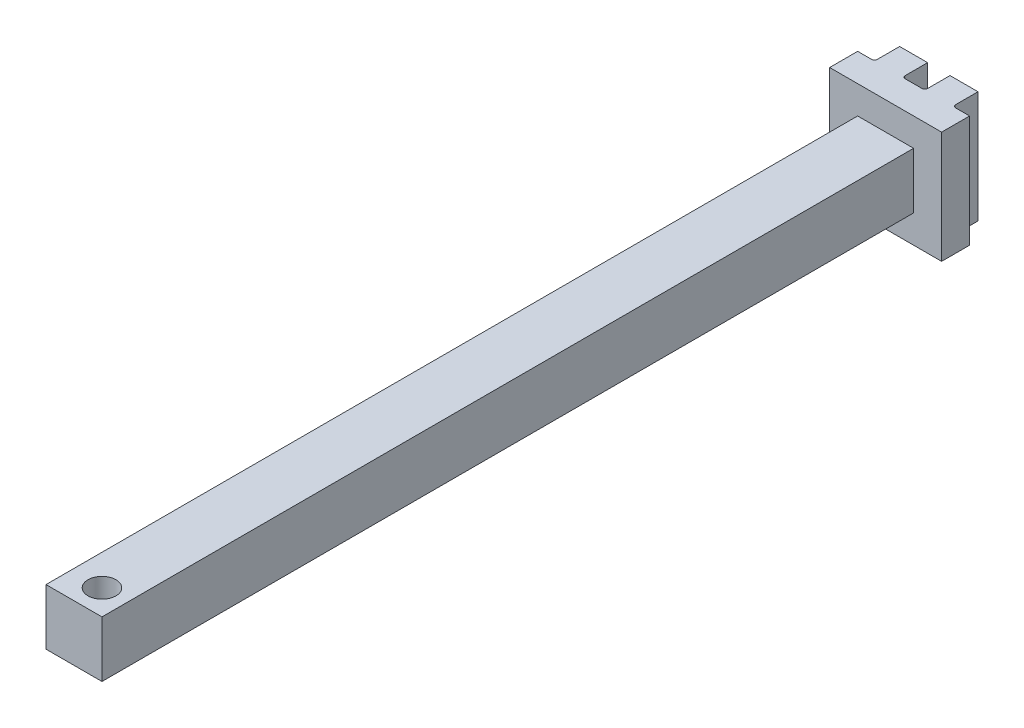
ISO-10303-21;
HEADER;
FILE_DESCRIPTION(('STEP AP214'),'2;1');
FILE_NAME('part.step','',(''),(''),'','','');
FILE_SCHEMA(('AUTOMOTIVE_DESIGN { 1 0 10303 214 1 1 1 1 }'));
ENDSEC;
DATA;
#1=APPLICATION_CONTEXT('core data for automotive mechanical design processes');
#2=APPLICATION_PROTOCOL_DEFINITION('international standard','automotive_design',2000,#1);
#3=PRODUCT_CONTEXT('',#1,'mechanical');
#4=PRODUCT('Part','Part','',(#3));
#5=PRODUCT_RELATED_PRODUCT_CATEGORY('part','',(#4));
#6=PRODUCT_DEFINITION_FORMATION('','',#4);
#7=PRODUCT_DEFINITION_CONTEXT('part definition',#1,'design');
#8=PRODUCT_DEFINITION('design','',#6,#7);
#9=PRODUCT_DEFINITION_SHAPE('','',#8);
#10=(LENGTH_UNIT() NAMED_UNIT(*) SI_UNIT(.MILLI.,.METRE.));
#11=(NAMED_UNIT(*) PLANE_ANGLE_UNIT() SI_UNIT($,.RADIAN.));
#12=(NAMED_UNIT(*) SI_UNIT($,.STERADIAN.) SOLID_ANGLE_UNIT());
#13=UNCERTAINTY_MEASURE_WITH_UNIT(LENGTH_MEASURE(1.E-05),#10,'distance_accuracy_value','');
#14=(GEOMETRIC_REPRESENTATION_CONTEXT(3) GLOBAL_UNCERTAINTY_ASSIGNED_CONTEXT((#13)) GLOBAL_UNIT_ASSIGNED_CONTEXT((#10,
#11,#12)) REPRESENTATION_CONTEXT('',''));
#15=CARTESIAN_POINT('',(0.,0.,0.));
#16=DIRECTION('',(0.,0.,1.));
#17=DIRECTION('',(1.,0.,0.));
#18=AXIS2_PLACEMENT_3D('',#15,#16,#17);
#19=CARTESIAN_POINT('',(0.,100.,0.));
#20=DIRECTION('',(0.,0.,-1.));
#21=DIRECTION('',(-1.,0.,0.));
#22=AXIS2_PLACEMENT_3D('',#19,#20,#21);
#23=PLANE('',#22);
#24=DIRECTION('',(-1.,0.,0.));
#25=VECTOR('',#24,1.);
#26=CARTESIAN_POINT('',(-50.,-50.,0.));
#27=LINE('',#26,#25);
#28=CARTESIAN_POINT('',(150.,-50.,0.));
#29=VERTEX_POINT('',#28);
#30=CARTESIAN_POINT('',(125.,-50.,0.));
#31=VERTEX_POINT('',#30);
#32=EDGE_CURVE('E227',#29,#31,#27,.T.);
#33=ORIENTED_EDGE('',*,*,#32,.T.);
#34=DIRECTION('',(0.,-1.,0.));
#35=VECTOR('',#34,1.);
#36=CARTESIAN_POINT('',(125.,150.,0.));
#37=LINE('',#36,#35);
#38=CARTESIAN_POINT('',(125.,150.,0.));
#39=VERTEX_POINT('',#38);
#40=EDGE_CURVE('E58',#31,#39,#37,.F.);
#41=ORIENTED_EDGE('',*,*,#40,.T.);
#42=DIRECTION('',(1.,0.,0.));
#43=VECTOR('',#42,1.);
#44=CARTESIAN_POINT('',(-50.,150.,0.));
#45=LINE('',#44,#43);
#46=CARTESIAN_POINT('',(150.,150.,0.));
#47=VERTEX_POINT('',#46);
#48=EDGE_CURVE('E239',#39,#47,#45,.T.);
#49=ORIENTED_EDGE('',*,*,#48,.T.);
#50=DIRECTION('',(0.,-1.,0.));
#51=VECTOR('',#50,1.);
#52=CARTESIAN_POINT('',(150.,-50.,0.));
#53=LINE('',#52,#51);
#54=EDGE_CURVE('E242',#47,#29,#53,.T.);
#55=ORIENTED_EDGE('',*,*,#54,.T.);
#56=EDGE_LOOP('',(#33,#41,#49,#55));
#57=FACE_BOUND('',#56,.T.);
#58=ADVANCED_FACE('F37',(#57),#23,.T.);
#59=CARTESIAN_POINT('',(-50.,150.,0.));
#60=VERTEX_POINT('',#59);
#61=CARTESIAN_POINT('',(-25.,150.,0.));
#62=VERTEX_POINT('',#61);
#63=EDGE_CURVE('E251',#60,#62,#45,.T.);
#64=ORIENTED_EDGE('',*,*,#63,.T.);
#65=DIRECTION('',(0.,-1.,0.));
#66=VECTOR('',#65,1.);
#67=CARTESIAN_POINT('',(-25.,-50.,0.));
#68=LINE('',#67,#66);
#69=CARTESIAN_POINT('',(-25.,-50.,0.));
#70=VERTEX_POINT('',#69);
#71=EDGE_CURVE('E282',#62,#70,#68,.T.);
#72=ORIENTED_EDGE('',*,*,#71,.T.);
#73=CARTESIAN_POINT('',(-50.,-50.,0.));
#74=VERTEX_POINT('',#73);
#75=EDGE_CURVE('E269',#70,#74,#27,.T.);
#76=ORIENTED_EDGE('',*,*,#75,.T.);
#77=DIRECTION('',(0.,1.,0.));
#78=VECTOR('',#77,1.);
#79=CARTESIAN_POINT('',(-50.,-50.,0.));
#80=LINE('',#79,#78);
#81=EDGE_CURVE('E221',#74,#60,#80,.T.);
#82=ORIENTED_EDGE('',*,*,#81,.T.);
#83=EDGE_LOOP('',(#64,#72,#76,#82));
#84=FACE_BOUND('',#83,.T.);
#85=ADVANCED_FACE('F367',(#84),#23,.T.);
#86=CARTESIAN_POINT('',(0.,0.,1500.));
#87=DIRECTION('',(1.,0.,0.));
#88=DIRECTION('',(0.,0.,-1.));
#89=AXIS2_PLACEMENT_3D('',#86,#87,#88);
#90=PLANE('',#89);
#91=DIRECTION('',(0.,1.,0.));
#92=VECTOR('',#91,1.);
#93=CARTESIAN_POINT('',(0.,0.,50.));
#94=LINE('',#93,#92);
#95=CARTESIAN_POINT('',(0.,0.,50.));
#96=VERTEX_POINT('',#95);
#97=CARTESIAN_POINT('',(0.,100.,50.));
#98=VERTEX_POINT('',#97);
#99=EDGE_CURVE('E348',#96,#98,#94,.T.);
#100=ORIENTED_EDGE('',*,*,#99,.F.);
#101=DIRECTION('',(0.,0.,-1.));
#102=VECTOR('',#101,1.);
#103=CARTESIAN_POINT('',(0.,0.,1500.));
#104=LINE('',#103,#102);
#105=CARTESIAN_POINT('',(0.,0.,1500.));
#106=VERTEX_POINT('',#105);
#107=EDGE_CURVE('E316',#106,#96,#104,.T.);
#108=ORIENTED_EDGE('',*,*,#107,.F.);
#109=DIRECTION('',(0.,-1.,0.));
#110=VECTOR('',#109,1.);
#111=CARTESIAN_POINT('',(0.,0.,1500.));
#112=LINE('',#111,#110);
#113=CARTESIAN_POINT('',(0.,100.,1500.));
#114=VERTEX_POINT('',#113);
#115=EDGE_CURVE('E339',#114,#106,#112,.T.);
#116=ORIENTED_EDGE('',*,*,#115,.F.);
#117=DIRECTION('',(0.,0.,-1.));
#118=VECTOR('',#117,1.);
#119=CARTESIAN_POINT('',(0.,100.,1500.));
#120=LINE('',#119,#118);
#121=EDGE_CURVE('E330',#114,#98,#120,.T.);
#122=ORIENTED_EDGE('',*,*,#121,.T.);
#123=EDGE_LOOP('',(#100,#108,#116,#122));
#124=FACE_BOUND('',#123,.T.);
#125=ADVANCED_FACE('F416',(#124),#90,.F.);
#126=CARTESIAN_POINT('',(0.,0.,1500.));
#127=DIRECTION('',(0.,1.,0.));
#128=DIRECTION('',(0.,0.,1.));
#129=AXIS2_PLACEMENT_3D('',#126,#127,#128);
#130=PLANE('',#129);
#131=CARTESIAN_POINT('',(55.,0.,1455.));
#132=DIRECTION('',(0.,-1.,0.));
#133=DIRECTION('',(0.,0.,-1.));
#134=AXIS2_PLACEMENT_3D('',#131,#132,#133);
#135=CIRCLE('',#134,25.);
#136=CARTESIAN_POINT('',(55.,0.,1430.));
#137=VERTEX_POINT('',#136);
#138=EDGE_CURVE('E345',#137,#137,#135,.T.);
#139=ORIENTED_EDGE('',*,*,#138,.F.);
#140=EDGE_LOOP('',(#139));
#141=FACE_BOUND('',#140,.T.);
#142=DIRECTION('',(-1.,0.,0.));
#143=VECTOR('',#142,1.);
#144=CARTESIAN_POINT('',(0.,0.,50.));
#145=LINE('',#144,#143);
#146=CARTESIAN_POINT('',(100.,0.,50.));
#147=VERTEX_POINT('',#146);
#148=EDGE_CURVE('E350',#147,#96,#145,.T.);
#149=ORIENTED_EDGE('',*,*,#148,.F.);
#150=DIRECTION('',(0.,0.,-1.));
#151=VECTOR('',#150,1.);
#152=CARTESIAN_POINT('',(100.,0.,1500.));
#153=LINE('',#152,#151);
#154=CARTESIAN_POINT('',(100.,0.,1500.));
#155=VERTEX_POINT('',#154);
#156=EDGE_CURVE('E321',#155,#147,#153,.T.);
#157=ORIENTED_EDGE('',*,*,#156,.F.);
#158=DIRECTION('',(1.,0.,0.));
#159=VECTOR('',#158,1.);
#160=CARTESIAN_POINT('',(0.,0.,1500.));
#161=LINE('',#160,#159);
#162=EDGE_CURVE('E337',#106,#155,#161,.T.);
#163=ORIENTED_EDGE('',*,*,#162,.F.);
#164=ORIENTED_EDGE('',*,*,#107,.T.);
#165=EDGE_LOOP('',(#149,#157,#163,#164));
#166=FACE_BOUND('',#165,.T.);
#167=ADVANCED_FACE('F454',(#141,#166),#130,.F.);
#168=CARTESIAN_POINT('',(100.,0.,1500.));
#169=DIRECTION('',(-1.,0.,0.));
#170=DIRECTION('',(0.,0.,1.));
#171=AXIS2_PLACEMENT_3D('',#168,#169,#170);
#172=PLANE('',#171);
#173=DIRECTION('',(0.,-1.,0.));
#174=VECTOR('',#173,1.);
#175=CARTESIAN_POINT('',(100.,0.,50.));
#176=LINE('',#175,#174);
#177=CARTESIAN_POINT('',(100.,100.,50.));
#178=VERTEX_POINT('',#177);
#179=EDGE_CURVE('E352',#178,#147,#176,.T.);
#180=ORIENTED_EDGE('',*,*,#179,.F.);
#181=DIRECTION('',(0.,0.,-1.));
#182=VECTOR('',#181,1.);
#183=CARTESIAN_POINT('',(100.,100.,1500.));
#184=LINE('',#183,#182);
#185=CARTESIAN_POINT('',(100.,100.,1500.));
#186=VERTEX_POINT('',#185);
#187=EDGE_CURVE('E326',#186,#178,#184,.T.);
#188=ORIENTED_EDGE('',*,*,#187,.F.);
#189=DIRECTION('',(0.,1.,0.));
#190=VECTOR('',#189,1.);
#191=CARTESIAN_POINT('',(100.,0.,1500.));
#192=LINE('',#191,#190);
#193=EDGE_CURVE('E335',#155,#186,#192,.T.);
#194=ORIENTED_EDGE('',*,*,#193,.F.);
#195=ORIENTED_EDGE('',*,*,#156,.T.);
#196=EDGE_LOOP('',(#180,#188,#194,#195));
#197=FACE_BOUND('',#196,.T.);
#198=ADVANCED_FACE('F446',(#197),#172,.F.);
#199=CARTESIAN_POINT('',(0.,100.,1500.));
#200=DIRECTION('',(0.,-1.,0.));
#201=DIRECTION('',(0.,0.,-1.));
#202=AXIS2_PLACEMENT_3D('',#199,#200,#201);
#203=PLANE('',#202);
#204=CARTESIAN_POINT('',(55.,100.,1455.));
#205=DIRECTION('',(0.,-1.,0.));
#206=DIRECTION('',(0.,0.,-1.));
#207=AXIS2_PLACEMENT_3D('',#204,#205,#206);
#208=CIRCLE('',#207,25.);
#209=CARTESIAN_POINT('',(55.,100.,1430.));
#210=VERTEX_POINT('',#209);
#211=EDGE_CURVE('E342',#210,#210,#208,.F.);
#212=ORIENTED_EDGE('',*,*,#211,.F.);
#213=EDGE_LOOP('',(#212));
#214=FACE_BOUND('',#213,.T.);
#215=DIRECTION('',(1.,0.,0.));
#216=VECTOR('',#215,1.);
#217=CARTESIAN_POINT('',(0.,100.,50.));
#218=LINE('',#217,#216);
#219=EDGE_CURVE('E256',#98,#178,#218,.T.);
#220=ORIENTED_EDGE('',*,*,#219,.F.);
#221=ORIENTED_EDGE('',*,*,#121,.F.);
#222=DIRECTION('',(-1.,0.,0.));
#223=VECTOR('',#222,1.);
#224=CARTESIAN_POINT('',(0.,100.,1500.));
#225=LINE('',#224,#223);
#226=EDGE_CURVE('E333',#186,#114,#225,.T.);
#227=ORIENTED_EDGE('',*,*,#226,.F.);
#228=ORIENTED_EDGE('',*,*,#187,.T.);
#229=EDGE_LOOP('',(#220,#221,#227,#228));
#230=FACE_BOUND('',#229,.T.);
#231=ADVANCED_FACE('F441',(#214,#230),#203,.F.);
#232=CARTESIAN_POINT('',(0.,100.,1500.));
#233=DIRECTION('',(0.,0.,-1.));
#234=DIRECTION('',(-1.,0.,0.));
#235=AXIS2_PLACEMENT_3D('',#232,#233,#234);
#236=PLANE('',#235);
#237=ORIENTED_EDGE('',*,*,#115,.T.);
#238=ORIENTED_EDGE('',*,*,#162,.T.);
#239=ORIENTED_EDGE('',*,*,#193,.T.);
#240=ORIENTED_EDGE('',*,*,#226,.T.);
#241=EDGE_LOOP('',(#237,#238,#239,#240));
#242=FACE_BOUND('',#241,.T.);
#243=ADVANCED_FACE('F438',(#242),#236,.F.);
#244=CARTESIAN_POINT('',(55.,100.001,1455.));
#245=DIRECTION('',(0.,-1.,0.));
#246=DIRECTION('',(0.,0.,-1.));
#247=AXIS2_PLACEMENT_3D('',#244,#245,#246);
#248=CYLINDRICAL_SURFACE('',#247,25.);
#249=ORIENTED_EDGE('',*,*,#138,.T.);
#250=EDGE_LOOP('',(#249));
#251=FACE_BOUND('',#250,.T.);
#252=ORIENTED_EDGE('',*,*,#211,.T.);
#253=EDGE_LOOP('',(#252));
#254=FACE_BOUND('',#253,.T.);
#255=ADVANCED_FACE('F436',(#251,#254),#248,.F.);
#256=CARTESIAN_POINT('',(-50.,150.,50.));
#257=DIRECTION('',(0.,0.,-1.));
#258=DIRECTION('',(-1.,0.,0.));
#259=AXIS2_PLACEMENT_3D('',#256,#257,#258);
#260=PLANE('',#259);
#261=DIRECTION('',(0.,1.,0.));
#262=VECTOR('',#261,1.);
#263=CARTESIAN_POINT('',(-50.,-50.,50.));
#264=LINE('',#263,#262);
#265=CARTESIAN_POINT('',(-50.,-50.,50.));
#266=VERTEX_POINT('',#265);
#267=CARTESIAN_POINT('',(-50.,150.,50.));
#268=VERTEX_POINT('',#267);
#269=EDGE_CURVE('E223',#266,#268,#264,.T.);
#270=ORIENTED_EDGE('',*,*,#269,.F.);
#271=DIRECTION('',(-1.,0.,0.));
#272=VECTOR('',#271,1.);
#273=CARTESIAN_POINT('',(-50.,-50.,50.));
#274=LINE('',#273,#272);
#275=CARTESIAN_POINT('',(150.,-50.,50.));
#276=VERTEX_POINT('',#275);
#277=EDGE_CURVE('E233',#276,#266,#274,.T.);
#278=ORIENTED_EDGE('',*,*,#277,.F.);
#279=DIRECTION('',(0.,-1.,0.));
#280=VECTOR('',#279,1.);
#281=CARTESIAN_POINT('',(150.,-50.,50.));
#282=LINE('',#281,#280);
#283=CARTESIAN_POINT('',(150.,150.,50.));
#284=VERTEX_POINT('',#283);
#285=EDGE_CURVE('E230',#284,#276,#282,.T.);
#286=ORIENTED_EDGE('',*,*,#285,.F.);
#287=DIRECTION('',(1.,0.,0.));
#288=VECTOR('',#287,1.);
#289=CARTESIAN_POINT('',(-50.,150.,50.));
#290=LINE('',#289,#288);
#291=EDGE_CURVE('E226',#268,#284,#290,.T.);
#292=ORIENTED_EDGE('',*,*,#291,.F.);
#293=EDGE_LOOP('',(#270,#278,#286,#292));
#294=FACE_BOUND('',#293,.T.);
#295=ORIENTED_EDGE('',*,*,#148,.T.);
#296=ORIENTED_EDGE('',*,*,#99,.T.);
#297=ORIENTED_EDGE('',*,*,#219,.T.);
#298=ORIENTED_EDGE('',*,*,#179,.T.);
#299=EDGE_LOOP('',(#295,#296,#297,#298));
#300=FACE_BOUND('',#299,.T.);
#301=ADVANCED_FACE('F372',(#294,#300),#260,.F.);
#302=CARTESIAN_POINT('',(-50.,-50.,50.));
#303=DIRECTION('',(-1.,0.,0.));
#304=DIRECTION('',(0.,0.,1.));
#305=AXIS2_PLACEMENT_3D('',#302,#303,#304);
#306=PLANE('',#305);
#307=ORIENTED_EDGE('',*,*,#81,.F.);
#308=DIRECTION('',(0.,0.,-1.));
#309=VECTOR('',#308,1.);
#310=CARTESIAN_POINT('',(-50.,-50.,50.));
#311=LINE('',#310,#309);
#312=EDGE_CURVE('E264',#266,#74,#311,.T.);
#313=ORIENTED_EDGE('',*,*,#312,.F.);
#314=ORIENTED_EDGE('',*,*,#269,.T.);
#315=DIRECTION('',(0.,0.,-1.));
#316=VECTOR('',#315,1.);
#317=CARTESIAN_POINT('',(-50.,150.,50.));
#318=LINE('',#317,#316);
#319=EDGE_CURVE('E236',#268,#60,#318,.T.);
#320=ORIENTED_EDGE('',*,*,#319,.T.);
#321=EDGE_LOOP('',(#307,#313,#314,#320));
#322=FACE_BOUND('',#321,.T.);
#323=ADVANCED_FACE('F366',(#322),#306,.T.);
#324=CARTESIAN_POINT('',(-50.,-50.,50.));
#325=DIRECTION('',(0.,-1.,0.));
#326=DIRECTION('',(1.,0.,0.));
#327=AXIS2_PLACEMENT_3D('',#324,#325,#326);
#328=PLANE('',#327);
#329=ORIENTED_EDGE('',*,*,#32,.F.);
#330=DIRECTION('',(0.,0.,-1.));
#331=VECTOR('',#330,1.);
#332=CARTESIAN_POINT('',(150.,-50.,50.));
#333=LINE('',#332,#331);
#334=EDGE_CURVE('E357',#276,#29,#333,.T.);
#335=ORIENTED_EDGE('',*,*,#334,.F.);
#336=ORIENTED_EDGE('',*,*,#277,.T.);
#337=ORIENTED_EDGE('',*,*,#312,.T.);
#338=ORIENTED_EDGE('',*,*,#75,.F.);
#339=CARTESIAN_POINT('',(-25.,-50.,-5.));
#340=DIRECTION('',(0.,-1.,0.));
#341=DIRECTION('',(1.,0.,0.));
#342=AXIS2_PLACEMENT_3D('',#339,#340,#341);
#343=CIRCLE('',#342,5.);
#344=CARTESIAN_POINT('',(-20.,-50.,-5.));
#345=VERTEX_POINT('',#344);
#346=EDGE_CURVE('E380',#70,#345,#343,.F.);
#347=ORIENTED_EDGE('',*,*,#346,.T.);
#348=DIRECTION('',(0.,0.,-1.));
#349=VECTOR('',#348,1.);
#350=CARTESIAN_POINT('',(-20.,-50.,0.));
#351=LINE('',#350,#349);
#352=CARTESIAN_POINT('',(-20.,-50.,-45.));
#353=VERTEX_POINT('',#352);
#354=EDGE_CURVE('E207',#345,#353,#351,.T.);
#355=ORIENTED_EDGE('',*,*,#354,.T.);
#356=DIRECTION('',(1.,0.,0.));
#357=VECTOR('',#356,1.);
#358=CARTESIAN_POINT('',(-20.,-50.,-45.));
#359=LINE('',#358,#357);
#360=CARTESIAN_POINT('',(30.,-50.,-45.));
#361=VERTEX_POINT('',#360);
#362=EDGE_CURVE('E208',#353,#361,#359,.T.);
#363=ORIENTED_EDGE('',*,*,#362,.T.);
#364=DIRECTION('',(0.,0.,1.));
#365=VECTOR('',#364,1.);
#366=CARTESIAN_POINT('',(30.,-50.,0.));
#367=LINE('',#366,#365);
#368=CARTESIAN_POINT('',(30.,-50.,-5.));
#369=VERTEX_POINT('',#368);
#370=EDGE_CURVE('E211',#361,#369,#367,.T.);
#371=ORIENTED_EDGE('',*,*,#370,.T.);
#372=CARTESIAN_POINT('',(35.,-50.,-5.));
#373=DIRECTION('',(0.,-1.,0.));
#374=DIRECTION('',(1.,0.,0.));
#375=AXIS2_PLACEMENT_3D('',#372,#373,#374);
#376=CIRCLE('',#375,5.);
#377=CARTESIAN_POINT('',(35.,-50.,0.));
#378=VERTEX_POINT('',#377);
#379=EDGE_CURVE('E306',#369,#378,#376,.F.);
#380=ORIENTED_EDGE('',*,*,#379,.T.);
#381=CARTESIAN_POINT('',(65.,-50.,0.));
#382=VERTEX_POINT('',#381);
#383=EDGE_CURVE('E259',#382,#378,#27,.T.);
#384=ORIENTED_EDGE('',*,*,#383,.F.);
#385=CARTESIAN_POINT('',(65.,-50.,-5.));
#386=DIRECTION('',(0.,-1.,0.));
#387=DIRECTION('',(1.,0.,0.));
#388=AXIS2_PLACEMENT_3D('',#385,#386,#387);
#389=CIRCLE('',#388,5.);
#390=CARTESIAN_POINT('',(70.,-50.,-5.));
#391=VERTEX_POINT('',#390);
#392=EDGE_CURVE('E379',#382,#391,#389,.F.);
#393=ORIENTED_EDGE('',*,*,#392,.T.);
#394=DIRECTION('',(0.,0.,-1.));
#395=VECTOR('',#394,1.);
#396=CARTESIAN_POINT('',(70.,-50.,0.));
#397=LINE('',#396,#395);
#398=CARTESIAN_POINT('',(70.,-50.,-45.));
#399=VERTEX_POINT('',#398);
#400=EDGE_CURVE('E203',#391,#399,#397,.T.);
#401=ORIENTED_EDGE('',*,*,#400,.T.);
#402=DIRECTION('',(1.,0.,0.));
#403=VECTOR('',#402,1.);
#404=CARTESIAN_POINT('',(70.,-50.,-45.));
#405=LINE('',#404,#403);
#406=CARTESIAN_POINT('',(120.,-50.,-45.));
#407=VERTEX_POINT('',#406);
#408=EDGE_CURVE('E199',#399,#407,#405,.T.);
#409=ORIENTED_EDGE('',*,*,#408,.T.);
#410=DIRECTION('',(0.,0.,1.));
#411=VECTOR('',#410,1.);
#412=CARTESIAN_POINT('',(120.,-50.,0.));
#413=LINE('',#412,#411);
#414=CARTESIAN_POINT('',(120.,-50.,-5.));
#415=VERTEX_POINT('',#414);
#416=EDGE_CURVE('E190',#407,#415,#413,.T.);
#417=ORIENTED_EDGE('',*,*,#416,.T.);
#418=CARTESIAN_POINT('',(125.,-50.,-5.));
#419=DIRECTION('',(0.,-1.,0.));
#420=DIRECTION('',(1.,0.,0.));
#421=AXIS2_PLACEMENT_3D('',#418,#419,#420);
#422=CIRCLE('',#421,5.);
#423=EDGE_CURVE('E45',#415,#31,#422,.F.);
#424=ORIENTED_EDGE('',*,*,#423,.T.);
#425=EDGE_LOOP('',(#329,#335,#336,#337,#338,#347,#355,#363,#371,#380,#384,#393,#401,#409,#417,#424));
#426=FACE_BOUND('',#425,.T.);
#427=ADVANCED_FACE('F304',(#426),#328,.T.);
#428=CARTESIAN_POINT('',(150.,-50.,50.));
#429=DIRECTION('',(1.,0.,0.));
#430=DIRECTION('',(0.,0.,-1.));
#431=AXIS2_PLACEMENT_3D('',#428,#429,#430);
#432=PLANE('',#431);
#433=ORIENTED_EDGE('',*,*,#54,.F.);
#434=DIRECTION('',(0.,0.,-1.));
#435=VECTOR('',#434,1.);
#436=CARTESIAN_POINT('',(150.,150.,50.));
#437=LINE('',#436,#435);
#438=EDGE_CURVE('E355',#284,#47,#437,.T.);
#439=ORIENTED_EDGE('',*,*,#438,.F.);
#440=ORIENTED_EDGE('',*,*,#285,.T.);
#441=ORIENTED_EDGE('',*,*,#334,.T.);
#442=EDGE_LOOP('',(#433,#439,#440,#441));
#443=FACE_BOUND('',#442,.T.);
#444=ADVANCED_FACE('F369',(#443),#432,.T.);
#445=CARTESIAN_POINT('',(-50.,150.,50.));
#446=DIRECTION('',(0.,1.,0.));
#447=DIRECTION('',(-1.,0.,0.));
#448=AXIS2_PLACEMENT_3D('',#445,#446,#447);
#449=PLANE('',#448);
#450=ORIENTED_EDGE('',*,*,#63,.F.);
#451=ORIENTED_EDGE('',*,*,#319,.F.);
#452=ORIENTED_EDGE('',*,*,#291,.T.);
#453=ORIENTED_EDGE('',*,*,#438,.T.);
#454=ORIENTED_EDGE('',*,*,#48,.F.);
#455=CARTESIAN_POINT('',(125.,150.,-5.));
#456=DIRECTION('',(0.,1.,0.));
#457=DIRECTION('',(-1.,0.,0.));
#458=AXIS2_PLACEMENT_3D('',#455,#456,#457);
#459=CIRCLE('',#458,5.);
#460=CARTESIAN_POINT('',(120.,150.,-5.));
#461=VERTEX_POINT('',#460);
#462=EDGE_CURVE('E11',#39,#461,#459,.F.);
#463=ORIENTED_EDGE('',*,*,#462,.T.);
#464=DIRECTION('',(0.,0.,1.));
#465=VECTOR('',#464,1.);
#466=CARTESIAN_POINT('',(120.,150.,0.));
#467=LINE('',#466,#465);
#468=CARTESIAN_POINT('',(120.,150.,-45.));
#469=VERTEX_POINT('',#468);
#470=EDGE_CURVE('E173',#469,#461,#467,.T.);
#471=ORIENTED_EDGE('',*,*,#470,.F.);
#472=DIRECTION('',(1.,0.,0.));
#473=VECTOR('',#472,1.);
#474=CARTESIAN_POINT('',(70.,150.,-45.));
#475=LINE('',#474,#473);
#476=CARTESIAN_POINT('',(70.,150.,-45.));
#477=VERTEX_POINT('',#476);
#478=EDGE_CURVE('E179',#477,#469,#475,.T.);
#479=ORIENTED_EDGE('',*,*,#478,.F.);
#480=DIRECTION('',(0.,0.,-1.));
#481=VECTOR('',#480,1.);
#482=CARTESIAN_POINT('',(70.,150.,0.));
#483=LINE('',#482,#481);
#484=CARTESIAN_POINT('',(70.,150.,-5.));
#485=VERTEX_POINT('',#484);
#486=EDGE_CURVE('E185',#485,#477,#483,.T.);
#487=ORIENTED_EDGE('',*,*,#486,.F.);
#488=CARTESIAN_POINT('',(65.,150.,-5.));
#489=DIRECTION('',(0.,1.,0.));
#490=DIRECTION('',(-1.,0.,0.));
#491=AXIS2_PLACEMENT_3D('',#488,#489,#490);
#492=CIRCLE('',#491,5.);
#493=CARTESIAN_POINT('',(65.,150.,0.));
#494=VERTEX_POINT('',#493);
#495=EDGE_CURVE('E382',#485,#494,#492,.F.);
#496=ORIENTED_EDGE('',*,*,#495,.T.);
#497=CARTESIAN_POINT('',(35.,150.,0.));
#498=VERTEX_POINT('',#497);
#499=EDGE_CURVE('E255',#498,#494,#45,.T.);
#500=ORIENTED_EDGE('',*,*,#499,.F.);
#501=CARTESIAN_POINT('',(35.,150.,-5.));
#502=DIRECTION('',(0.,1.,0.));
#503=DIRECTION('',(-1.,0.,0.));
#504=AXIS2_PLACEMENT_3D('',#501,#502,#503);
#505=CIRCLE('',#504,5.);
#506=CARTESIAN_POINT('',(30.,150.,-5.));
#507=VERTEX_POINT('',#506);
#508=EDGE_CURVE('E384',#498,#507,#505,.F.);
#509=ORIENTED_EDGE('',*,*,#508,.T.);
#510=DIRECTION('',(0.,0.,1.));
#511=VECTOR('',#510,1.);
#512=CARTESIAN_POINT('',(30.,150.,0.));
#513=LINE('',#512,#511);
#514=CARTESIAN_POINT('',(30.,150.,-45.));
#515=VERTEX_POINT('',#514);
#516=EDGE_CURVE('E217',#515,#507,#513,.T.);
#517=ORIENTED_EDGE('',*,*,#516,.F.);
#518=DIRECTION('',(1.,0.,0.));
#519=VECTOR('',#518,1.);
#520=CARTESIAN_POINT('',(-20.,150.,-45.));
#521=LINE('',#520,#519);
#522=CARTESIAN_POINT('',(-20.,150.,-45.));
#523=VERTEX_POINT('',#522);
#524=EDGE_CURVE('E212',#523,#515,#521,.T.);
#525=ORIENTED_EDGE('',*,*,#524,.F.);
#526=DIRECTION('',(0.,0.,-1.));
#527=VECTOR('',#526,1.);
#528=CARTESIAN_POINT('',(-20.,150.,0.));
#529=LINE('',#528,#527);
#530=CARTESIAN_POINT('',(-20.,150.,-5.));
#531=VERTEX_POINT('',#530);
#532=EDGE_CURVE('E222',#531,#523,#529,.T.);
#533=ORIENTED_EDGE('',*,*,#532,.F.);
#534=CARTESIAN_POINT('',(-25.,150.,-5.));
#535=DIRECTION('',(0.,1.,0.));
#536=DIRECTION('',(-1.,0.,0.));
#537=AXIS2_PLACEMENT_3D('',#534,#535,#536);
#538=CIRCLE('',#537,5.);
#539=EDGE_CURVE('E375',#531,#62,#538,.F.);
#540=ORIENTED_EDGE('',*,*,#539,.T.);
#541=EDGE_LOOP('',(#450,#451,#452,#453,#454,#463,#471,#479,#487,#496,#500,#509,#517,#525,#533,#540));
#542=FACE_BOUND('',#541,.T.);
#543=ADVANCED_FACE('F176',(#542),#449,.T.);
#544=ORIENTED_EDGE('',*,*,#383,.T.);
#545=DIRECTION('',(0.,-1.,0.));
#546=VECTOR('',#545,1.);
#547=CARTESIAN_POINT('',(35.,150.,0.));
#548=LINE('',#547,#546);
#549=EDGE_CURVE('E281',#378,#498,#548,.F.);
#550=ORIENTED_EDGE('',*,*,#549,.T.);
#551=ORIENTED_EDGE('',*,*,#499,.T.);
#552=DIRECTION('',(0.,-1.,0.));
#553=VECTOR('',#552,1.);
#554=CARTESIAN_POINT('',(65.,-50.,0.));
#555=LINE('',#554,#553);
#556=EDGE_CURVE('E279',#494,#382,#555,.T.);
#557=ORIENTED_EDGE('',*,*,#556,.T.);
#558=EDGE_LOOP('',(#544,#550,#551,#557));
#559=FACE_BOUND('',#558,.T.);
#560=ADVANCED_FACE('F392',(#559),#23,.T.);
#561=CARTESIAN_POINT('',(-20.,217.268120235369,-45.));
#562=DIRECTION('',(0.,0.,-1.));
#563=DIRECTION('',(-1.,0.,0.));
#564=AXIS2_PLACEMENT_3D('',#561,#562,#563);
#565=PLANE('',#564);
#566=DIRECTION('',(0.,-1.,0.));
#567=VECTOR('',#566,1.);
#568=CARTESIAN_POINT('',(-20.,217.268120235369,-45.));
#569=LINE('',#568,#567);
#570=EDGE_CURVE('E218',#523,#353,#569,.T.);
#571=ORIENTED_EDGE('',*,*,#570,.F.);
#572=ORIENTED_EDGE('',*,*,#524,.T.);
#573=DIRECTION('',(0.,-1.,0.));
#574=VECTOR('',#573,1.);
#575=CARTESIAN_POINT('',(30.,217.268120235369,-45.));
#576=LINE('',#575,#574);
#577=EDGE_CURVE('E215',#515,#361,#576,.T.);
#578=ORIENTED_EDGE('',*,*,#577,.T.);
#579=ORIENTED_EDGE('',*,*,#362,.F.);
#580=EDGE_LOOP('',(#571,#572,#578,#579));
#581=FACE_BOUND('',#580,.T.);
#582=ADVANCED_FACE('F420',(#581),#565,.T.);
#583=CARTESIAN_POINT('',(30.,217.268120235369,0.));
#584=DIRECTION('',(1.,0.,0.));
#585=DIRECTION('',(0.,1.,0.));
#586=AXIS2_PLACEMENT_3D('',#583,#584,#585);
#587=PLANE('',#586);
#588=ORIENTED_EDGE('',*,*,#516,.T.);
#589=DIRECTION('',(0.,-1.,0.));
#590=VECTOR('',#589,1.);
#591=CARTESIAN_POINT('',(30.,-50.,-5.));
#592=LINE('',#591,#590);
#593=EDGE_CURVE('E275',#507,#369,#592,.T.);
#594=ORIENTED_EDGE('',*,*,#593,.T.);
#595=ORIENTED_EDGE('',*,*,#370,.F.);
#596=ORIENTED_EDGE('',*,*,#577,.F.);
#597=EDGE_LOOP('',(#588,#594,#595,#596));
#598=FACE_BOUND('',#597,.T.);
#599=ADVANCED_FACE('F311',(#598),#587,.T.);
#600=CARTESIAN_POINT('',(-20.,217.268120235369,0.));
#601=DIRECTION('',(-1.,0.,0.));
#602=DIRECTION('',(0.,-1.,0.));
#603=AXIS2_PLACEMENT_3D('',#600,#601,#602);
#604=PLANE('',#603);
#605=ORIENTED_EDGE('',*,*,#354,.F.);
#606=DIRECTION('',(0.,-1.,0.));
#607=VECTOR('',#606,1.);
#608=CARTESIAN_POINT('',(-20.,150.,-5.));
#609=LINE('',#608,#607);
#610=EDGE_CURVE('E287',#345,#531,#609,.F.);
#611=ORIENTED_EDGE('',*,*,#610,.T.);
#612=ORIENTED_EDGE('',*,*,#532,.T.);
#613=ORIENTED_EDGE('',*,*,#570,.T.);
#614=EDGE_LOOP('',(#605,#611,#612,#613));
#615=FACE_BOUND('',#614,.T.);
#616=ADVANCED_FACE('F532',(#615),#604,.T.);
#617=CARTESIAN_POINT('',(70.,217.268120235369,-45.));
#618=DIRECTION('',(0.,0.,-1.));
#619=DIRECTION('',(-1.,0.,0.));
#620=AXIS2_PLACEMENT_3D('',#617,#618,#619);
#621=PLANE('',#620);
#622=DIRECTION('',(0.,-1.,0.));
#623=VECTOR('',#622,1.);
#624=CARTESIAN_POINT('',(70.,217.268120235369,-45.));
#625=LINE('',#624,#623);
#626=EDGE_CURVE('E197',#477,#399,#625,.T.);
#627=ORIENTED_EDGE('',*,*,#626,.F.);
#628=ORIENTED_EDGE('',*,*,#478,.T.);
#629=DIRECTION('',(0.,-1.,0.));
#630=VECTOR('',#629,1.);
#631=CARTESIAN_POINT('',(120.,217.268120235369,-45.));
#632=LINE('',#631,#630);
#633=EDGE_CURVE('E186',#469,#407,#632,.T.);
#634=ORIENTED_EDGE('',*,*,#633,.T.);
#635=ORIENTED_EDGE('',*,*,#408,.F.);
#636=EDGE_LOOP('',(#627,#628,#634,#635));
#637=FACE_BOUND('',#636,.T.);
#638=ADVANCED_FACE('F195',(#637),#621,.T.);
#639=CARTESIAN_POINT('',(120.,217.268120235369,0.));
#640=DIRECTION('',(1.,0.,0.));
#641=DIRECTION('',(0.,0.,-1.));
#642=AXIS2_PLACEMENT_3D('',#639,#640,#641);
#643=PLANE('',#642);
#644=ORIENTED_EDGE('',*,*,#470,.T.);
#645=DIRECTION('',(0.,-1.,0.));
#646=VECTOR('',#645,1.);
#647=CARTESIAN_POINT('',(120.,-50.,-5.));
#648=LINE('',#647,#646);
#649=EDGE_CURVE('E397',#461,#415,#648,.T.);
#650=ORIENTED_EDGE('',*,*,#649,.T.);
#651=ORIENTED_EDGE('',*,*,#416,.F.);
#652=ORIENTED_EDGE('',*,*,#633,.F.);
#653=EDGE_LOOP('',(#644,#650,#651,#652));
#654=FACE_BOUND('',#653,.T.);
#655=ADVANCED_FACE('F189',(#654),#643,.T.);
#656=CARTESIAN_POINT('',(70.,217.268120235369,0.));
#657=DIRECTION('',(-1.,0.,0.));
#658=DIRECTION('',(0.,-1.,0.));
#659=AXIS2_PLACEMENT_3D('',#656,#657,#658);
#660=PLANE('',#659);
#661=ORIENTED_EDGE('',*,*,#400,.F.);
#662=DIRECTION('',(0.,-1.,0.));
#663=VECTOR('',#662,1.);
#664=CARTESIAN_POINT('',(70.,150.,-5.));
#665=LINE('',#664,#663);
#666=EDGE_CURVE('E291',#391,#485,#665,.F.);
#667=ORIENTED_EDGE('',*,*,#666,.T.);
#668=ORIENTED_EDGE('',*,*,#486,.T.);
#669=ORIENTED_EDGE('',*,*,#626,.T.);
#670=EDGE_LOOP('',(#661,#667,#668,#669));
#671=FACE_BOUND('',#670,.T.);
#672=ADVANCED_FACE('F396',(#671),#660,.T.);
#673=CARTESIAN_POINT('',(35.,217.268120235369,-5.));
#674=DIRECTION('',(0.,1.,0.));
#675=DIRECTION('',(-1.,0.,0.));
#676=AXIS2_PLACEMENT_3D('',#673,#674,#675);
#677=CYLINDRICAL_SURFACE('',#676,5.);
#678=ORIENTED_EDGE('',*,*,#508,.F.);
#679=ORIENTED_EDGE('',*,*,#549,.F.);
#680=ORIENTED_EDGE('',*,*,#379,.F.);
#681=ORIENTED_EDGE('',*,*,#593,.F.);
#682=EDGE_LOOP('',(#678,#679,#680,#681));
#683=FACE_BOUND('',#682,.T.);
#684=ADVANCED_FACE('F400',(#683),#677,.F.);
#685=CARTESIAN_POINT('',(-25.,100.,-5.));
#686=DIRECTION('',(0.,1.,0.));
#687=DIRECTION('',(-1.,0.,0.));
#688=AXIS2_PLACEMENT_3D('',#685,#686,#687);
#689=CYLINDRICAL_SURFACE('',#688,5.);
#690=ORIENTED_EDGE('',*,*,#539,.F.);
#691=ORIENTED_EDGE('',*,*,#610,.F.);
#692=ORIENTED_EDGE('',*,*,#346,.F.);
#693=ORIENTED_EDGE('',*,*,#71,.F.);
#694=EDGE_LOOP('',(#690,#691,#692,#693));
#695=FACE_BOUND('',#694,.T.);
#696=ADVANCED_FACE('F402',(#695),#689,.F.);
#697=CARTESIAN_POINT('',(65.,100.,-5.));
#698=DIRECTION('',(0.,1.,0.));
#699=DIRECTION('',(-1.,0.,0.));
#700=AXIS2_PLACEMENT_3D('',#697,#698,#699);
#701=CYLINDRICAL_SURFACE('',#700,5.);
#702=ORIENTED_EDGE('',*,*,#495,.F.);
#703=ORIENTED_EDGE('',*,*,#666,.F.);
#704=ORIENTED_EDGE('',*,*,#392,.F.);
#705=ORIENTED_EDGE('',*,*,#556,.F.);
#706=EDGE_LOOP('',(#702,#703,#704,#705));
#707=FACE_BOUND('',#706,.T.);
#708=ADVANCED_FACE('F393',(#707),#701,.F.);
#709=CARTESIAN_POINT('',(125.,217.268120235369,-5.));
#710=DIRECTION('',(0.,1.,0.));
#711=DIRECTION('',(-1.,0.,0.));
#712=AXIS2_PLACEMENT_3D('',#709,#710,#711);
#713=CYLINDRICAL_SURFACE('',#712,5.);
#714=ORIENTED_EDGE('',*,*,#462,.F.);
#715=ORIENTED_EDGE('',*,*,#40,.F.);
#716=ORIENTED_EDGE('',*,*,#423,.F.);
#717=ORIENTED_EDGE('',*,*,#649,.F.);
#718=EDGE_LOOP('',(#714,#715,#716,#717));
#719=FACE_BOUND('',#718,.T.);
#720=ADVANCED_FACE('F39',(#719),#713,.F.);
#721=CLOSED_SHELL('',(#58,#85,#125,#167,#198,#231,#243,#255,#301,#323,#427,#444,#543,#560,#582,
#599,#616,#638,#655,#672,#684,#696,#708,#720));
#722=MANIFOLD_SOLID_BREP('B2',#721);
#723=ADVANCED_BREP_SHAPE_REPRESENTATION('',(#18,#722),#14);
#724=SHAPE_DEFINITION_REPRESENTATION(#9,#723);
ENDSEC;
END-ISO-10303-21;
